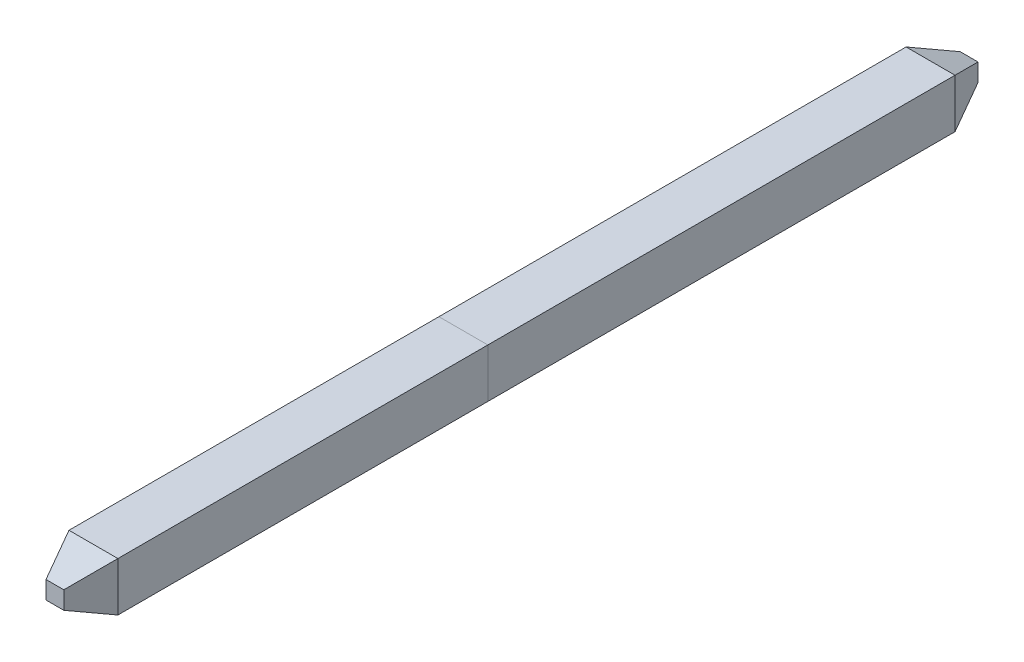
ISO-10303-21;
HEADER;
FILE_DESCRIPTION(('STEP AP214'),'2;1');
FILE_NAME('part.step','',(''),(''),'','','');
FILE_SCHEMA(('AUTOMOTIVE_DESIGN { 1 0 10303 214 1 1 1 1 }'));
ENDSEC;
DATA;
#1=APPLICATION_CONTEXT('core data for automotive mechanical design processes');
#2=APPLICATION_PROTOCOL_DEFINITION('international standard','automotive_design',2000,#1);
#3=PRODUCT_CONTEXT('',#1,'mechanical');
#4=PRODUCT('Part','Part','',(#3));
#5=PRODUCT_RELATED_PRODUCT_CATEGORY('part','',(#4));
#6=PRODUCT_DEFINITION_FORMATION('','',#4);
#7=PRODUCT_DEFINITION_CONTEXT('part definition',#1,'design');
#8=PRODUCT_DEFINITION('design','',#6,#7);
#9=PRODUCT_DEFINITION_SHAPE('','',#8);
#10=(LENGTH_UNIT() NAMED_UNIT(*) SI_UNIT(.MILLI.,.METRE.));
#11=(NAMED_UNIT(*) PLANE_ANGLE_UNIT() SI_UNIT($,.RADIAN.));
#12=(NAMED_UNIT(*) SI_UNIT($,.STERADIAN.) SOLID_ANGLE_UNIT());
#13=UNCERTAINTY_MEASURE_WITH_UNIT(LENGTH_MEASURE(1.E-05),#10,'distance_accuracy_value','');
#14=(GEOMETRIC_REPRESENTATION_CONTEXT(3) GLOBAL_UNCERTAINTY_ASSIGNED_CONTEXT((#13)) GLOBAL_UNIT_ASSIGNED_CONTEXT((#10,
#11,#12)) REPRESENTATION_CONTEXT('',''));
#15=CARTESIAN_POINT('',(0.,0.,0.));
#16=DIRECTION('',(0.,0.,1.));
#17=DIRECTION('',(1.,0.,0.));
#18=AXIS2_PLACEMENT_3D('',#15,#16,#17);
#19=CARTESIAN_POINT('',(130.07810289916,3.280276448111,8.563075922013));
#20=DIRECTION('',(0.,0.,-1.));
#21=DIRECTION('',(0.,-1.,0.));
#22=AXIS2_PLACEMENT_3D('',#19,#20,#21);
#23=PLANE('',#22);
#24=CARTESIAN_POINT('',(130.28011599441,3.48228957868855,8.563075922013));
#25=DIRECTION('',(0.999999999999996,8.7422776386913E-08,0.));
#26=VECTOR('',#25,1.);
#27=LINE('',#24,#26);
#28=CARTESIAN_POINT('',(130.28011599441,3.48228957868865,8.56307592201305));
#29=VERTEX_POINT('',#28);
#30=CARTESIAN_POINT('',(130.511089768579,3.48228959888079,8.56307592201276));
#31=VERTEX_POINT('',#30);
#32=EDGE_CURVE('E79',#29,#31,#27,.T.);
#33=ORIENTED_EDGE('',*,*,#32,.T.);
#34=CARTESIAN_POINT('',(130.511089768579,3.482289598881,8.563075922013));
#35=DIRECTION('',(-8.74228064307184E-08,0.999999999999996,0.));
#36=VECTOR('',#35,1.);
#37=LINE('',#34,#36);
#38=CARTESIAN_POINT('',(130.511089748389,3.71326337304611,8.56307592201287));
#39=VERTEX_POINT('',#38);
#40=EDGE_CURVE('E113',#31,#39,#37,.T.);
#41=ORIENTED_EDGE('',*,*,#40,.T.);
#42=CARTESIAN_POINT('',(130.51108974839,3.71326337304592,8.563075922013));
#43=DIRECTION('',(-0.999999999999996,-8.7422776386913E-08,0.));
#44=VECTOR('',#43,1.);
#45=LINE('',#42,#44);
#46=CARTESIAN_POINT('',(130.280115974219,3.71326335285384,8.56307592201316));
#47=VERTEX_POINT('',#46);
#48=EDGE_CURVE('E99',#39,#47,#45,.T.);
#49=ORIENTED_EDGE('',*,*,#48,.T.);
#50=CARTESIAN_POINT('',(130.28011599441,3.482289578689,8.56307592201264));
#51=DIRECTION('',(-8.74228064307181E-08,0.999999999999996,0.));
#52=VECTOR('',#51,1.);
#53=LINE('',#50,#52);
#54=EDGE_CURVE('E97',#29,#47,#53,.T.);
#55=ORIENTED_EDGE('',*,*,#54,.F.);
#56=EDGE_LOOP('',(#33,#41,#49,#55));
#57=FACE_BOUND('',#56,.T.);
#58=ADVANCED_FACE('F18',(#57),#23,.F.);
#59=CARTESIAN_POINT('',(130.07810288149,3.482289561028,8.563075922013));
#60=DIRECTION('',(-8.10569869603111E-08,0.927183854566784,-0.374606593415913));
#61=DIRECTION('',(-0.999999999999977,0.,2.16378964986114E-07));
#62=AXIS2_PLACEMENT_3D('',#59,#60,#61);
#63=PLANE('',#62);
#64=CARTESIAN_POINT('',(130.07810289916,3.2802764481105,8.0630759220132));
#65=DIRECTION('',(0.999999999999996,8.74227766676701E-08,0.));
#66=VECTOR('',#65,1.);
#67=LINE('',#64,#66);
#68=CARTESIAN_POINT('',(130.078102899156,3.28027644811098,8.06307592201364));
#69=VERTEX_POINT('',#68);
#70=CARTESIAN_POINT('',(130.713102899157,3.28027650362392,8.06307592201288));
#71=VERTEX_POINT('',#70);
#72=EDGE_CURVE('E197',#69,#71,#67,.T.);
#73=ORIENTED_EDGE('',*,*,#72,.T.);
#74=CARTESIAN_POINT('',(130.713102899154,3.28027650362308,8.06307592201101));
#75=DIRECTION('',(-0.350800465555175,0.35080040421938,0.868261544562347));
#76=VECTOR('',#75,1.);
#77=LINE('',#74,#76);
#78=EDGE_CURVE('E90',#71,#31,#77,.T.);
#79=ORIENTED_EDGE('',*,*,#78,.T.);
#80=ORIENTED_EDGE('',*,*,#32,.F.);
#81=CARTESIAN_POINT('',(130.078102899154,3.28027644811088,8.06307592201531));
#82=DIRECTION('',(0.350800404219385,0.35080046555517,0.868261544562346));
#83=VECTOR('',#82,1.);
#84=LINE('',#81,#83);
#85=EDGE_CURVE('E86',#69,#29,#84,.T.);
#86=ORIENTED_EDGE('',*,*,#85,.F.);
#87=EDGE_LOOP('',(#73,#79,#80,#86));
#88=FACE_BOUND('',#87,.T.);
#89=ADVANCED_FACE('F84',(#88),#63,.F.);
#90=CARTESIAN_POINT('',(130.51108978624,3.280276485963,8.563075922013));
#91=DIRECTION('',(-0.927183854566784,-8.10569869729111E-08,-0.374606593415913));
#92=DIRECTION('',(-0.374606593415914,0.,0.927183854566787));
#93=AXIS2_PLACEMENT_3D('',#90,#91,#92);
#94=PLANE('',#93);
#95=ORIENTED_EDGE('',*,*,#40,.F.);
#96=ORIENTED_EDGE('',*,*,#78,.F.);
#97=CARTESIAN_POINT('',(130.713102899157,3.280276503624,8.06307592201443));
#98=DIRECTION('',(-8.74228074009595E-08,0.999999999999996,0.));
#99=VECTOR('',#98,1.);
#100=LINE('',#97,#99);
#101=CARTESIAN_POINT('',(130.713102843642,3.91527650362404,8.0630759220136));
#102=VERTEX_POINT('',#101);
#103=EDGE_CURVE('E155',#71,#102,#100,.T.);
#104=ORIENTED_EDGE('',*,*,#103,.T.);
#105=CARTESIAN_POINT('',(130.713102843644,3.91527650362332,8.0630759220142));
#106=DIRECTION('',(-0.350800404219386,-0.350800465555169,0.868261544562346));
#107=VECTOR('',#106,1.);
#108=LINE('',#105,#107);
#109=EDGE_CURVE('E184',#102,#39,#108,.T.);
#110=ORIENTED_EDGE('',*,*,#109,.T.);
#111=EDGE_LOOP('',(#95,#96,#104,#110));
#112=FACE_BOUND('',#111,.T.);
#113=ADVANCED_FACE('F132',(#112),#94,.F.);
#114=CARTESIAN_POINT('',(130.07810284364,3.915276448111,8.063075922013));
#115=DIRECTION('',(-0.927183854566784,-8.10569869477111E-08,0.374606593415913));
#116=DIRECTION('',(-8.74227765598698E-08,1.,0.));
#117=AXIS2_PLACEMENT_3D('',#114,#115,#116);
#118=PLANE('',#117);
#119=ORIENTED_EDGE('',*,*,#85,.T.);
#120=ORIENTED_EDGE('',*,*,#54,.T.);
#121=CARTESIAN_POINT('',(130.280115974218,3.71326335285385,8.56307592201359));
#122=DIRECTION('',(-0.350800465555275,0.350800404219178,-0.868261544562388));
#123=VECTOR('',#122,1.);
#124=LINE('',#121,#123);
#125=CARTESIAN_POINT('',(130.07810284364,3.915276448111,8.063075922013));
#126=VERTEX_POINT('',#125);
#127=EDGE_CURVE('E198',#47,#126,#124,.T.);
#128=ORIENTED_EDGE('',*,*,#127,.T.);
#129=CARTESIAN_POINT('',(130.078102899153,3.280276448111,8.063075922013));
#130=DIRECTION('',(-8.74227636913917E-08,0.999999999999996,0.));
#131=VECTOR('',#130,1.);
#132=LINE('',#129,#131);
#133=EDGE_CURVE('E109',#69,#126,#132,.T.);
#134=ORIENTED_EDGE('',*,*,#133,.F.);
#135=EDGE_LOOP('',(#119,#120,#128,#134));
#136=FACE_BOUND('',#135,.T.);
#137=ADVANCED_FACE('F108',(#136),#118,.T.);
#138=CARTESIAN_POINT('',(130.07810284364,3.915276448111,8.063075922013));
#139=DIRECTION('',(8.10569869603111E-08,-0.927183854566784,-0.374606593415913));
#140=DIRECTION('',(0.,0.374606593415914,-0.927183854566787));
#141=AXIS2_PLACEMENT_3D('',#138,#139,#140);
#142=PLANE('',#141);
#143=CARTESIAN_POINT('',(130.71310284364,3.91527650362446,8.063075922013));
#144=DIRECTION('',(-0.999999999999996,-8.74227759847081E-08,0.));
#145=VECTOR('',#144,1.);
#146=LINE('',#143,#145);
#147=EDGE_CURVE('E224',#102,#126,#146,.T.);
#148=ORIENTED_EDGE('',*,*,#147,.T.);
#149=ORIENTED_EDGE('',*,*,#127,.F.);
#150=ORIENTED_EDGE('',*,*,#48,.F.);
#151=ORIENTED_EDGE('',*,*,#109,.F.);
#152=EDGE_LOOP('',(#148,#149,#150,#151));
#153=FACE_BOUND('',#152,.T.);
#154=ADVANCED_FACE('F131',(#153),#142,.F.);
#155=CARTESIAN_POINT('',(130.07810289916,3.280276448111,-3.298724077987));
#156=DIRECTION('',(-8.74227765734797E-08,1.,0.));
#157=DIRECTION('',(0.,0.,1.));
#158=AXIS2_PLACEMENT_3D('',#155,#156,#157);
#159=PLANE('',#158);
#160=CARTESIAN_POINT('',(130.71310289916,3.28027650362446,3.263075922013));
#161=DIRECTION('',(0.,0.,1.));
#162=VECTOR('',#161,1.);
#163=LINE('',#160,#162);
#164=CARTESIAN_POINT('',(130.713102899157,3.28027650362423,3.263075922013));
#165=VERTEX_POINT('',#164);
#166=EDGE_CURVE('E293',#165,#71,#163,.T.);
#167=ORIENTED_EDGE('',*,*,#166,.T.);
#168=ORIENTED_EDGE('',*,*,#72,.F.);
#169=CARTESIAN_POINT('',(130.078102899153,3.280276448111,3.26307592201296));
#170=DIRECTION('',(0.,0.,1.));
#171=VECTOR('',#170,1.);
#172=LINE('',#169,#171);
#173=CARTESIAN_POINT('',(130.078102899157,3.280276448111,3.263075922013));
#174=VERTEX_POINT('',#173);
#175=EDGE_CURVE('E368',#174,#69,#172,.T.);
#176=ORIENTED_EDGE('',*,*,#175,.F.);
#177=CARTESIAN_POINT('',(130.07810289916,3.280276448111,3.263075922013));
#178=DIRECTION('',(0.999999999999996,8.74227766676701E-08,0.));
#179=VECTOR('',#178,1.);
#180=LINE('',#177,#179);
#181=EDGE_CURVE('E674',#174,#165,#180,.T.);
#182=ORIENTED_EDGE('',*,*,#181,.T.);
#183=EDGE_LOOP('',(#167,#168,#176,#182));
#184=FACE_BOUND('',#183,.T.);
#185=ADVANCED_FACE('F434',(#184),#159,.F.);
#186=CARTESIAN_POINT('',(130.71310284364,3.915276503624,8.563075922013));
#187=DIRECTION('',(-1.,-8.74227765734797E-08,0.));
#188=DIRECTION('',(-8.74227765734797E-08,1.,0.));
#189=AXIS2_PLACEMENT_3D('',#186,#187,#188);
#190=PLANE('',#189);
#191=CARTESIAN_POINT('',(130.71310284364,3.915276503624,3.26307592201296));
#192=DIRECTION('',(0.,0.,1.));
#193=VECTOR('',#192,1.);
#194=LINE('',#191,#193);
#195=CARTESIAN_POINT('',(130.71310284364,3.91527650362423,3.263075922013));
#196=VERTEX_POINT('',#195);
#197=EDGE_CURVE('E320',#196,#102,#194,.T.);
#198=ORIENTED_EDGE('',*,*,#197,.T.);
#199=ORIENTED_EDGE('',*,*,#103,.F.);
#200=ORIENTED_EDGE('',*,*,#166,.F.);
#201=CARTESIAN_POINT('',(130.713102899153,3.280276503624,3.26307592201296));
#202=DIRECTION('',(-8.74227636913917E-08,0.999999999999996,0.));
#203=VECTOR('',#202,1.);
#204=LINE('',#201,#203);
#205=EDGE_CURVE('E611',#165,#196,#204,.T.);
#206=ORIENTED_EDGE('',*,*,#205,.T.);
#207=EDGE_LOOP('',(#198,#199,#200,#206));
#208=FACE_BOUND('',#207,.T.);
#209=ADVANCED_FACE('F442',(#208),#190,.F.);
#210=CARTESIAN_POINT('',(130.07810284364,3.915276448111,8.563075922013));
#211=DIRECTION('',(-1.,-8.74227765734797E-08,0.));
#212=DIRECTION('',(-8.74227765734797E-08,1.,0.));
#213=AXIS2_PLACEMENT_3D('',#210,#211,#212);
#214=PLANE('',#213);
#215=ORIENTED_EDGE('',*,*,#175,.T.);
#216=ORIENTED_EDGE('',*,*,#133,.T.);
#217=CARTESIAN_POINT('',(130.07810284364,3.915276448111,8.063075922013));
#218=DIRECTION('',(0.,0.,-1.));
#219=VECTOR('',#218,1.);
#220=LINE('',#217,#219);
#221=CARTESIAN_POINT('',(130.07810284364,3.915276448111,3.263075922013));
#222=VERTEX_POINT('',#221);
#223=EDGE_CURVE('E38',#126,#222,#220,.T.);
#224=ORIENTED_EDGE('',*,*,#223,.T.);
#225=CARTESIAN_POINT('',(130.078102899153,3.280276448111,3.26307592201296));
#226=DIRECTION('',(-8.74227636913917E-08,0.999999999999996,0.));
#227=VECTOR('',#226,1.);
#228=LINE('',#225,#227);
#229=EDGE_CURVE('E603',#174,#222,#228,.T.);
#230=ORIENTED_EDGE('',*,*,#229,.F.);
#231=EDGE_LOOP('',(#215,#216,#224,#230));
#232=FACE_BOUND('',#231,.T.);
#233=ADVANCED_FACE('F452',(#232),#214,.T.);
#234=CARTESIAN_POINT('',(130.07810284364,3.915276448111,8.563075922013));
#235=DIRECTION('',(8.74227765734797E-08,-1.,0.));
#236=DIRECTION('',(0.,0.,-1.));
#237=AXIS2_PLACEMENT_3D('',#234,#235,#236);
#238=PLANE('',#237);
#239=ORIENTED_EDGE('',*,*,#223,.F.);
#240=ORIENTED_EDGE('',*,*,#147,.F.);
#241=ORIENTED_EDGE('',*,*,#197,.F.);
#242=CARTESIAN_POINT('',(130.71310284364,3.91527650362446,3.263075922013));
#243=DIRECTION('',(-0.999999999999996,-8.74227759847081E-08,0.));
#244=VECTOR('',#243,1.);
#245=LINE('',#242,#244);
#246=EDGE_CURVE('E30',#196,#222,#245,.T.);
#247=ORIENTED_EDGE('',*,*,#246,.T.);
#248=EDGE_LOOP('',(#239,#240,#241,#247));
#249=FACE_BOUND('',#248,.T.);
#250=ADVANCED_FACE('F463',(#249),#238,.F.);
#251=CARTESIAN_POINT('',(130.07810289916,3.280276448111,-2.798724077987));
#252=DIRECTION('',(-8.10569869603111E-08,0.927183854566784,0.374606593415913));
#253=DIRECTION('',(0.999999999999977,0.,2.16378964986114E-07));
#254=AXIS2_PLACEMENT_3D('',#251,#252,#253);
#255=PLANE('',#254);
#256=CARTESIAN_POINT('',(130.71310289916,3.28027650362446,-2.798724077987));
#257=DIRECTION('',(-0.999999999999996,-8.74227766676701E-08,0.));
#258=VECTOR('',#257,1.);
#259=LINE('',#256,#258);
#260=CARTESIAN_POINT('',(130.713102899156,3.28027650362402,-2.79872407798628));
#261=VERTEX_POINT('',#260);
#262=CARTESIAN_POINT('',(130.078102899157,3.280276448111,-2.79872407798756));
#263=VERTEX_POINT('',#262);
#264=EDGE_CURVE('E689',#261,#263,#259,.T.);
#265=ORIENTED_EDGE('',*,*,#264,.T.);
#266=CARTESIAN_POINT('',(130.280115994411,3.48228957868819,-3.2987240779871));
#267=DIRECTION('',(-0.350800404219391,-0.35080046555517,0.868261544562344));
#268=VECTOR('',#267,1.);
#269=LINE('',#266,#268);
#270=CARTESIAN_POINT('',(130.280115994412,3.48228957868867,-3.29872407798677));
#271=VERTEX_POINT('',#270);
#272=EDGE_CURVE('E711',#271,#263,#269,.T.);
#273=ORIENTED_EDGE('',*,*,#272,.F.);
#274=CARTESIAN_POINT('',(130.28011599441,3.48228957868904,-3.2987240779868));
#275=DIRECTION('',(0.999999999999996,8.7422776386913E-08,0.));
#276=VECTOR('',#275,1.);
#277=LINE('',#274,#276);
#278=CARTESIAN_POINT('',(130.511089768576,3.48228959888092,-3.29872407798635));
#279=VERTEX_POINT('',#278);
#280=EDGE_CURVE('E742',#271,#279,#277,.T.);
#281=ORIENTED_EDGE('',*,*,#280,.T.);
#282=CARTESIAN_POINT('',(130.511089768576,3.48228959888089,-3.29872407798551));
#283=DIRECTION('',(0.350800465555175,-0.35080040421938,0.868261544562347));
#284=VECTOR('',#283,1.);
#285=LINE('',#282,#284);
#286=EDGE_CURVE('E719',#279,#261,#285,.T.);
#287=ORIENTED_EDGE('',*,*,#286,.T.);
#288=EDGE_LOOP('',(#265,#273,#281,#287));
#289=FACE_BOUND('',#288,.T.);
#290=ADVANCED_FACE('F472',(#289),#255,.F.);
#291=CARTESIAN_POINT('',(130.07810284364,3.915276448111,-3.298724077987));
#292=DIRECTION('',(0.,0.,1.));
#293=DIRECTION('',(0.,-1.,0.));
#294=AXIS2_PLACEMENT_3D('',#291,#292,#293);
#295=PLANE('',#294);
#296=CARTESIAN_POINT('',(130.28011597422,3.71326335285355,-3.298724077987));
#297=DIRECTION('',(0.999999999999996,8.7422776386913E-08,0.));
#298=VECTOR('',#297,1.);
#299=LINE('',#296,#298);
#300=CARTESIAN_POINT('',(130.280115974219,3.71326335285372,-3.29872407798731));
#301=VERTEX_POINT('',#300);
#302=CARTESIAN_POINT('',(130.511089748384,3.71326337304628,-3.29872407798606));
#303=VERTEX_POINT('',#302);
#304=EDGE_CURVE('E666',#301,#303,#299,.T.);
#305=ORIENTED_EDGE('',*,*,#304,.T.);
#306=CARTESIAN_POINT('',(130.511089748381,3.713263373046,-3.298724077987));
#307=DIRECTION('',(8.74228064307187E-08,-0.999999999999996,0.));
#308=VECTOR('',#307,1.);
#309=LINE('',#306,#308);
#310=EDGE_CURVE('E734',#303,#279,#309,.T.);
#311=ORIENTED_EDGE('',*,*,#310,.T.);
#312=ORIENTED_EDGE('',*,*,#280,.F.);
#313=CARTESIAN_POINT('',(130.280115974218,3.713263352854,-3.29872407798783));
#314=DIRECTION('',(8.74228064307182E-08,-0.999999999999996,0.));
#315=VECTOR('',#314,1.);
#316=LINE('',#313,#315);
#317=EDGE_CURVE('E696',#301,#271,#316,.T.);
#318=ORIENTED_EDGE('',*,*,#317,.F.);
#319=EDGE_LOOP('',(#305,#311,#312,#318));
#320=FACE_BOUND('',#319,.T.);
#321=ADVANCED_FACE('F485',(#320),#295,.F.);
#322=CARTESIAN_POINT('',(130.51108973072,3.915276485963,-3.298724077987));
#323=DIRECTION('',(-0.927183854566784,-8.10569870116711E-08,0.374606593415913));
#324=DIRECTION('',(-8.74227766288529E-08,1.,0.));
#325=AXIS2_PLACEMENT_3D('',#322,#323,#324);
#326=PLANE('',#325);
#327=ORIENTED_EDGE('',*,*,#310,.F.);
#328=CARTESIAN_POINT('',(130.511089748382,3.71326337304689,-3.29872407798402));
#329=DIRECTION('',(0.350800404219348,0.35080046555518,0.868261544562358));
#330=VECTOR('',#329,1.);
#331=LINE('',#328,#330);
#332=CARTESIAN_POINT('',(130.713102843639,3.91527650362417,-2.79872407798671));
#333=VERTEX_POINT('',#332);
#334=EDGE_CURVE('E657',#303,#333,#331,.T.);
#335=ORIENTED_EDGE('',*,*,#334,.T.);
#336=CARTESIAN_POINT('',(130.713102843638,3.915276503624,-2.79872407798614));
#337=DIRECTION('',(8.74227636913914E-08,-0.999999999999996,0.));
#338=VECTOR('',#337,1.);
#339=LINE('',#336,#338);
#340=EDGE_CURVE('E633',#333,#261,#339,.T.);
#341=ORIENTED_EDGE('',*,*,#340,.T.);
#342=ORIENTED_EDGE('',*,*,#286,.F.);
#343=EDGE_LOOP('',(#327,#335,#341,#342));
#344=FACE_BOUND('',#343,.T.);
#345=ADVANCED_FACE('F494',(#344),#326,.F.);
#346=CARTESIAN_POINT('',(130.07810284364,3.915276448111,-2.798724077987));
#347=DIRECTION('',(-0.927183854566784,-8.10569869089511E-08,-0.374606593415913));
#348=DIRECTION('',(-0.374606593415914,0.,0.927183854566787));
#349=AXIS2_PLACEMENT_3D('',#346,#347,#348);
#350=PLANE('',#349);
#351=CARTESIAN_POINT('',(130.07810284364,3.915276448111,-2.798724077987));
#352=DIRECTION('',(0.350800465555275,-0.350800404219179,-0.868261544562388));
#353=VECTOR('',#352,1.);
#354=LINE('',#351,#353);
#355=CARTESIAN_POINT('',(130.07810284364,3.91527644811091,-2.79872407798725));
#356=VERTEX_POINT('',#355);
#357=EDGE_CURVE('E641',#356,#301,#354,.T.);
#358=ORIENTED_EDGE('',*,*,#357,.T.);
#359=ORIENTED_EDGE('',*,*,#317,.T.);
#360=ORIENTED_EDGE('',*,*,#272,.T.);
#361=CARTESIAN_POINT('',(130.07810284364,3.915276448111,-2.79872407798709));
#362=DIRECTION('',(8.74227636913917E-08,-0.999999999999996,0.));
#363=VECTOR('',#362,1.);
#364=LINE('',#361,#363);
#365=EDGE_CURVE('E593',#356,#263,#364,.T.);
#366=ORIENTED_EDGE('',*,*,#365,.F.);
#367=EDGE_LOOP('',(#358,#359,#360,#366));
#368=FACE_BOUND('',#367,.T.);
#369=ADVANCED_FACE('F503',(#368),#350,.T.);
#370=CARTESIAN_POINT('',(130.07810289916,3.280276448111,-3.298724077987));
#371=DIRECTION('',(-8.74227765734797E-08,1.,0.));
#372=DIRECTION('',(0.,0.,1.));
#373=AXIS2_PLACEMENT_3D('',#370,#371,#372);
#374=PLANE('',#373);
#375=ORIENTED_EDGE('',*,*,#181,.F.);
#376=CARTESIAN_POINT('',(130.078102899153,3.280276448111,-2.79872407798709));
#377=DIRECTION('',(0.,0.,1.));
#378=VECTOR('',#377,1.);
#379=LINE('',#376,#378);
#380=EDGE_CURVE('E586',#263,#174,#379,.T.);
#381=ORIENTED_EDGE('',*,*,#380,.F.);
#382=ORIENTED_EDGE('',*,*,#264,.F.);
#383=CARTESIAN_POINT('',(130.71310289916,3.28027650362446,-2.798724077987));
#384=DIRECTION('',(0.,0.,1.));
#385=VECTOR('',#384,1.);
#386=LINE('',#383,#385);
#387=EDGE_CURVE('E625',#261,#165,#386,.T.);
#388=ORIENTED_EDGE('',*,*,#387,.T.);
#389=EDGE_LOOP('',(#375,#381,#382,#388));
#390=FACE_BOUND('',#389,.T.);
#391=ADVANCED_FACE('F512',(#390),#374,.F.);
#392=CARTESIAN_POINT('',(130.0781028613,3.713263335193,-3.298724077987));
#393=DIRECTION('',(8.10569869603111E-08,-0.927183854566784,0.374606593415913));
#394=DIRECTION('',(-1.,-8.74227765734594E-08,0.));
#395=AXIS2_PLACEMENT_3D('',#392,#393,#394);
#396=PLANE('',#395);
#397=CARTESIAN_POINT('',(130.07810284364,3.91527644811064,-2.79872407798685));
#398=DIRECTION('',(0.999999999999996,8.74227759847081E-08,0.));
#399=VECTOR('',#398,1.);
#400=LINE('',#397,#399);
#401=EDGE_CURVE('E592',#356,#333,#400,.T.);
#402=ORIENTED_EDGE('',*,*,#401,.T.);
#403=ORIENTED_EDGE('',*,*,#334,.F.);
#404=ORIENTED_EDGE('',*,*,#304,.F.);
#405=ORIENTED_EDGE('',*,*,#357,.F.);
#406=EDGE_LOOP('',(#402,#403,#404,#405));
#407=FACE_BOUND('',#406,.T.);
#408=ADVANCED_FACE('F521',(#407),#396,.F.);
#409=CARTESIAN_POINT('',(130.71310284364,3.915276503624,8.563075922013));
#410=DIRECTION('',(-1.,-8.74227765734797E-08,0.));
#411=DIRECTION('',(-8.74227765734797E-08,1.,0.));
#412=AXIS2_PLACEMENT_3D('',#409,#410,#411);
#413=PLANE('',#412);
#414=ORIENTED_EDGE('',*,*,#205,.F.);
#415=ORIENTED_EDGE('',*,*,#387,.F.);
#416=ORIENTED_EDGE('',*,*,#340,.F.);
#417=CARTESIAN_POINT('',(130.71310284364,3.915276503624,-2.79872407798709));
#418=DIRECTION('',(0.,0.,1.));
#419=VECTOR('',#418,1.);
#420=LINE('',#417,#419);
#421=EDGE_CURVE('E789',#333,#196,#420,.T.);
#422=ORIENTED_EDGE('',*,*,#421,.T.);
#423=EDGE_LOOP('',(#414,#415,#416,#422));
#424=FACE_BOUND('',#423,.T.);
#425=ADVANCED_FACE('F530',(#424),#413,.F.);
#426=CARTESIAN_POINT('',(130.07810284364,3.915276448111,8.563075922013));
#427=DIRECTION('',(-1.,-8.74227765734797E-08,0.));
#428=DIRECTION('',(-8.74227765734797E-08,1.,0.));
#429=AXIS2_PLACEMENT_3D('',#426,#427,#428);
#430=PLANE('',#429);
#431=ORIENTED_EDGE('',*,*,#365,.T.);
#432=ORIENTED_EDGE('',*,*,#380,.T.);
#433=ORIENTED_EDGE('',*,*,#229,.T.);
#434=CARTESIAN_POINT('',(130.07810284364,3.915276448111,3.26307592201296));
#435=DIRECTION('',(0.,0.,-1.));
#436=VECTOR('',#435,1.);
#437=LINE('',#434,#436);
#438=EDGE_CURVE('E11',#222,#356,#437,.T.);
#439=ORIENTED_EDGE('',*,*,#438,.T.);
#440=EDGE_LOOP('',(#431,#432,#433,#439));
#441=FACE_BOUND('',#440,.T.);
#442=ADVANCED_FACE('F539',(#441),#430,.T.);
#443=CARTESIAN_POINT('',(130.07810284364,3.915276448111,8.563075922013));
#444=DIRECTION('',(8.74227765734797E-08,-1.,0.));
#445=DIRECTION('',(0.,0.,-1.));
#446=AXIS2_PLACEMENT_3D('',#443,#444,#445);
#447=PLANE('',#446);
#448=ORIENTED_EDGE('',*,*,#246,.F.);
#449=ORIENTED_EDGE('',*,*,#421,.F.);
#450=ORIENTED_EDGE('',*,*,#401,.F.);
#451=ORIENTED_EDGE('',*,*,#438,.F.);
#452=EDGE_LOOP('',(#448,#449,#450,#451));
#453=FACE_BOUND('',#452,.T.);
#454=ADVANCED_FACE('F548',(#453),#447,.F.);
#455=CLOSED_SHELL('',(#58,#89,#113,#137,#154,#185,#209,#233,#250,#290,#321,#345,#369,#391,#408,
#425,#442,#454));
#456=MANIFOLD_SOLID_BREP('B1',#455);
#457=ADVANCED_BREP_SHAPE_REPRESENTATION('',(#18,#456),#14);
#458=SHAPE_DEFINITION_REPRESENTATION(#9,#457);
ENDSEC;
END-ISO-10303-21;
